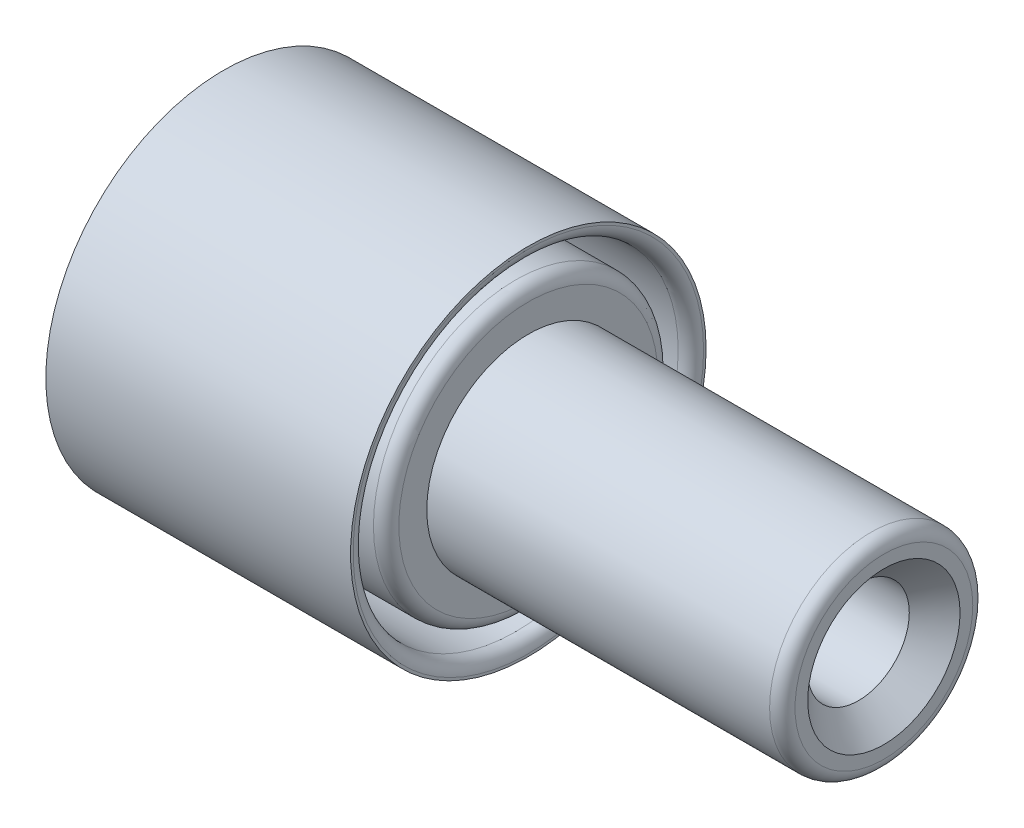
ISO-10303-21;
HEADER;
FILE_DESCRIPTION(('STEP AP214'),'2;1');
FILE_NAME('part.step','',(''),(''),'','','');
FILE_SCHEMA(('AUTOMOTIVE_DESIGN { 1 0 10303 214 1 1 1 1 }'));
ENDSEC;
DATA;
#1=APPLICATION_CONTEXT('core data for automotive mechanical design processes');
#2=APPLICATION_PROTOCOL_DEFINITION('international standard','automotive_design',2000,#1);
#3=PRODUCT_CONTEXT('',#1,'mechanical');
#4=PRODUCT('Part','Part','',(#3));
#5=PRODUCT_RELATED_PRODUCT_CATEGORY('part','',(#4));
#6=PRODUCT_DEFINITION_FORMATION('','',#4);
#7=PRODUCT_DEFINITION_CONTEXT('part definition',#1,'design');
#8=PRODUCT_DEFINITION('design','',#6,#7);
#9=PRODUCT_DEFINITION_SHAPE('','',#8);
#10=(LENGTH_UNIT() NAMED_UNIT(*) SI_UNIT(.MILLI.,.METRE.));
#11=(NAMED_UNIT(*) PLANE_ANGLE_UNIT() SI_UNIT($,.RADIAN.));
#12=(NAMED_UNIT(*) SI_UNIT($,.STERADIAN.) SOLID_ANGLE_UNIT());
#13=UNCERTAINTY_MEASURE_WITH_UNIT(LENGTH_MEASURE(1.E-05),#10,'distance_accuracy_value','');
#14=(GEOMETRIC_REPRESENTATION_CONTEXT(3) GLOBAL_UNCERTAINTY_ASSIGNED_CONTEXT((#13)) GLOBAL_UNIT_ASSIGNED_CONTEXT((#10,
#11,#12)) REPRESENTATION_CONTEXT('',''));
#15=CARTESIAN_POINT('',(0.,0.,0.));
#16=DIRECTION('',(0.,0.,1.));
#17=DIRECTION('',(1.,0.,0.));
#18=AXIS2_PLACEMENT_3D('',#15,#16,#17);
#19=CARTESIAN_POINT('',(12.,0.,0.));
#20=DIRECTION('',(-1.,0.,0.));
#21=DIRECTION('',(0.,0.,1.));
#22=AXIS2_PLACEMENT_3D('',#19,#20,#21);
#23=CYLINDRICAL_SURFACE('',#22,7.);
#24=CARTESIAN_POINT('',(12.,0.,0.));
#25=DIRECTION('',(1.,0.,0.));
#26=DIRECTION('',(0.,0.,-1.));
#27=AXIS2_PLACEMENT_3D('',#24,#25,#26);
#28=CIRCLE('',#27,7.);
#29=CARTESIAN_POINT('',(12.,0.,-7.));
#30=VERTEX_POINT('',#29);
#31=EDGE_CURVE('E88',#30,#30,#28,.T.);
#32=ORIENTED_EDGE('',*,*,#31,.F.);
#33=EDGE_LOOP('',(#32));
#34=FACE_BOUND('',#33,.T.);
#35=CARTESIAN_POINT('',(0.,0.,0.));
#36=DIRECTION('',(1.,0.,0.));
#37=DIRECTION('',(0.,0.,-1.));
#38=AXIS2_PLACEMENT_3D('',#35,#36,#37);
#39=CIRCLE('',#38,7.);
#40=CARTESIAN_POINT('',(0.,0.,-7.));
#41=VERTEX_POINT('',#40);
#42=EDGE_CURVE('E85',#41,#41,#39,.T.);
#43=ORIENTED_EDGE('',*,*,#42,.T.);
#44=EDGE_LOOP('',(#43));
#45=FACE_BOUND('',#44,.T.);
#46=ADVANCED_FACE('F46',(#34,#45),#23,.T.);
#47=CARTESIAN_POINT('',(12.,0.,0.));
#48=DIRECTION('',(1.,0.,0.));
#49=DIRECTION('',(0.,0.,-1.));
#50=AXIS2_PLACEMENT_3D('',#47,#48,#49);
#51=PLANE('',#50);
#52=CARTESIAN_POINT('',(12.,0.,0.));
#53=DIRECTION('',(1.,0.,0.));
#54=DIRECTION('',(0.,0.,-1.));
#55=AXIS2_PLACEMENT_3D('',#52,#53,#54);
#56=CIRCLE('',#55,6.9);
#57=CARTESIAN_POINT('',(12.,0.,-6.9));
#58=VERTEX_POINT('',#57);
#59=EDGE_CURVE('E66',#58,#58,#56,.F.);
#60=ORIENTED_EDGE('',*,*,#59,.T.);
#61=EDGE_LOOP('',(#60));
#62=FACE_BOUND('',#61,.T.);
#63=ORIENTED_EDGE('',*,*,#31,.T.);
#64=EDGE_LOOP('',(#63));
#65=FACE_BOUND('',#64,.T.);
#66=ADVANCED_FACE('F107',(#62,#65),#51,.T.);
#67=CARTESIAN_POINT('',(0.,0.,0.));
#68=DIRECTION('',(1.,0.,0.));
#69=DIRECTION('',(0.,0.,-1.));
#70=AXIS2_PLACEMENT_3D('',#67,#68,#69);
#71=PLANE('',#70);
#72=CARTESIAN_POINT('',(0.,0.,0.));
#73=DIRECTION('',(1.,0.,0.));
#74=DIRECTION('',(0.,0.,-1.));
#75=AXIS2_PLACEMENT_3D('',#72,#73,#74);
#76=CIRCLE('',#75,3.5);
#77=CARTESIAN_POINT('',(0.,0.,3.5));
#78=VERTEX_POINT('',#77);
#79=EDGE_CURVE('E81',#78,#78,#76,.T.);
#80=ORIENTED_EDGE('',*,*,#79,.T.);
#81=EDGE_LOOP('',(#80));
#82=FACE_BOUND('',#81,.T.);
#83=ORIENTED_EDGE('',*,*,#42,.F.);
#84=EDGE_LOOP('',(#83));
#85=FACE_BOUND('',#84,.T.);
#86=ADVANCED_FACE('F120',(#82,#85),#71,.F.);
#87=CARTESIAN_POINT('',(2.,0.,0.));
#88=DIRECTION('',(1.,0.,0.));
#89=DIRECTION('',(0.,0.,-1.));
#90=AXIS2_PLACEMENT_3D('',#87,#88,#89);
#91=CYLINDRICAL_SURFACE('',#90,5.6);
#92=CARTESIAN_POINT('',(11.5,0.,0.));
#93=DIRECTION('',(1.,0.,0.));
#94=DIRECTION('',(0.,0.,-1.));
#95=AXIS2_PLACEMENT_3D('',#92,#93,#94);
#96=CIRCLE('',#95,5.6);
#97=CARTESIAN_POINT('',(11.5,0.,-5.6));
#98=VERTEX_POINT('',#97);
#99=EDGE_CURVE('E57',#98,#98,#96,.F.);
#100=ORIENTED_EDGE('',*,*,#99,.T.);
#101=EDGE_LOOP('',(#100));
#102=FACE_BOUND('',#101,.T.);
#103=CARTESIAN_POINT('',(2.,0.,0.));
#104=DIRECTION('',(1.,0.,0.));
#105=DIRECTION('',(0.,0.,-1.));
#106=AXIS2_PLACEMENT_3D('',#103,#104,#105);
#107=CIRCLE('',#106,5.6);
#108=CARTESIAN_POINT('',(2.,0.,-5.6));
#109=VERTEX_POINT('',#108);
#110=EDGE_CURVE('E94',#109,#109,#107,.T.);
#111=ORIENTED_EDGE('',*,*,#110,.T.);
#112=EDGE_LOOP('',(#111));
#113=FACE_BOUND('',#112,.T.);
#114=ADVANCED_FACE('F153',(#102,#113),#91,.T.);
#115=CARTESIAN_POINT('',(2.,0.,0.));
#116=DIRECTION('',(1.,0.,0.));
#117=DIRECTION('',(0.,0.,-1.));
#118=AXIS2_PLACEMENT_3D('',#115,#116,#117);
#119=CYLINDRICAL_SURFACE('',#118,6.4);
#120=CARTESIAN_POINT('',(11.5,0.,0.));
#121=DIRECTION('',(1.,0.,0.));
#122=DIRECTION('',(0.,0.,-1.));
#123=AXIS2_PLACEMENT_3D('',#120,#121,#122);
#124=CIRCLE('',#123,6.4);
#125=CARTESIAN_POINT('',(11.5,0.,-6.4));
#126=VERTEX_POINT('',#125);
#127=EDGE_CURVE('E69',#126,#126,#124,.T.);
#128=ORIENTED_EDGE('',*,*,#127,.T.);
#129=EDGE_LOOP('',(#128));
#130=FACE_BOUND('',#129,.T.);
#131=CARTESIAN_POINT('',(2.,0.,0.));
#132=DIRECTION('',(1.,0.,0.));
#133=DIRECTION('',(0.,0.,-1.));
#134=AXIS2_PLACEMENT_3D('',#131,#132,#133);
#135=CIRCLE('',#134,6.4);
#136=CARTESIAN_POINT('',(2.,0.,-6.4));
#137=VERTEX_POINT('',#136);
#138=EDGE_CURVE('E89',#137,#137,#135,.T.);
#139=ORIENTED_EDGE('',*,*,#138,.F.);
#140=EDGE_LOOP('',(#139));
#141=FACE_BOUND('',#140,.T.);
#142=ADVANCED_FACE('F114',(#130,#141),#119,.F.);
#143=CARTESIAN_POINT('',(2.,0.,0.));
#144=DIRECTION('',(1.,0.,0.));
#145=DIRECTION('',(0.,0.,-1.));
#146=AXIS2_PLACEMENT_3D('',#143,#144,#145);
#147=PLANE('',#146);
#148=ORIENTED_EDGE('',*,*,#110,.F.);
#149=EDGE_LOOP('',(#148));
#150=FACE_BOUND('',#149,.T.);
#151=ORIENTED_EDGE('',*,*,#138,.T.);
#152=EDGE_LOOP('',(#151));
#153=FACE_BOUND('',#152,.T.);
#154=ADVANCED_FACE('F104',(#150,#153),#147,.T.);
#155=CARTESIAN_POINT('',(12.,0.,0.));
#156=DIRECTION('',(1.,0.,0.));
#157=DIRECTION('',(0.,0.,-1.));
#158=AXIS2_PLACEMENT_3D('',#155,#156,#157);
#159=CIRCLE('',#158,5.1);
#160=CARTESIAN_POINT('',(12.,0.,-5.1));
#161=VERTEX_POINT('',#160);
#162=EDGE_CURVE('E61',#161,#161,#159,.T.);
#163=ORIENTED_EDGE('',*,*,#162,.T.);
#164=EDGE_LOOP('',(#163));
#165=FACE_BOUND('',#164,.T.);
#166=CARTESIAN_POINT('',(12.,0.,0.));
#167=DIRECTION('',(1.,0.,0.));
#168=DIRECTION('',(0.,0.,-1.));
#169=AXIS2_PLACEMENT_3D('',#166,#167,#168);
#170=CIRCLE('',#169,4.);
#171=CARTESIAN_POINT('',(12.,0.,-4.));
#172=VERTEX_POINT('',#171);
#173=EDGE_CURVE('E84',#172,#172,#170,.T.);
#174=ORIENTED_EDGE('',*,*,#173,.F.);
#175=EDGE_LOOP('',(#174));
#176=FACE_BOUND('',#175,.T.);
#177=ADVANCED_FACE('F102',(#165,#176),#51,.T.);
#178=CARTESIAN_POINT('',(26.,0.,0.));
#179=DIRECTION('',(-1.,0.,0.));
#180=DIRECTION('',(0.,0.,1.));
#181=AXIS2_PLACEMENT_3D('',#178,#179,#180);
#182=CYLINDRICAL_SURFACE('',#181,4.);
#183=CARTESIAN_POINT('',(25.5,0.,0.));
#184=DIRECTION('',(1.,0.,0.));
#185=DIRECTION('',(0.,0.,-1.));
#186=AXIS2_PLACEMENT_3D('',#183,#184,#185);
#187=CIRCLE('',#186,4.);
#188=CARTESIAN_POINT('',(25.5,0.,-4.));
#189=VERTEX_POINT('',#188);
#190=EDGE_CURVE('E12',#189,#189,#187,.F.);
#191=ORIENTED_EDGE('',*,*,#190,.T.);
#192=EDGE_LOOP('',(#191));
#193=FACE_BOUND('',#192,.T.);
#194=ORIENTED_EDGE('',*,*,#173,.T.);
#195=EDGE_LOOP('',(#194));
#196=FACE_BOUND('',#195,.T.);
#197=ADVANCED_FACE('F100',(#193,#196),#182,.T.);
#198=CARTESIAN_POINT('',(26.,0.,0.));
#199=DIRECTION('',(1.,0.,0.));
#200=DIRECTION('',(0.,0.,-1.));
#201=AXIS2_PLACEMENT_3D('',#198,#199,#200);
#202=PLANE('',#201);
#203=CARTESIAN_POINT('',(26.,0.,0.));
#204=DIRECTION('',(1.,0.,0.));
#205=DIRECTION('',(0.,0.,-1.));
#206=AXIS2_PLACEMENT_3D('',#203,#204,#205);
#207=CIRCLE('',#206,3.5);
#208=CARTESIAN_POINT('',(26.,0.,-3.5));
#209=VERTEX_POINT('',#208);
#210=EDGE_CURVE('E53',#209,#209,#207,.T.);
#211=ORIENTED_EDGE('',*,*,#210,.T.);
#212=EDGE_LOOP('',(#211));
#213=FACE_BOUND('',#212,.T.);
#214=CARTESIAN_POINT('',(26.,0.,0.));
#215=DIRECTION('',(1.,0.,0.));
#216=DIRECTION('',(0.,0.,-1.));
#217=AXIS2_PLACEMENT_3D('',#214,#215,#216);
#218=CIRCLE('',#217,3.00000000000001);
#219=CARTESIAN_POINT('',(26.,0.,-3.00000000000001));
#220=VERTEX_POINT('',#219);
#221=EDGE_CURVE('E72',#220,#220,#218,.F.);
#222=ORIENTED_EDGE('',*,*,#221,.T.);
#223=EDGE_LOOP('',(#222));
#224=FACE_BOUND('',#223,.T.);
#225=ADVANCED_FACE('F112',(#213,#224),#202,.T.);
#226=CARTESIAN_POINT('',(0.,0.,0.));
#227=DIRECTION('',(1.,0.,0.));
#228=DIRECTION('',(0.,0.,-1.));
#229=AXIS2_PLACEMENT_3D('',#226,#227,#228);
#230=CYLINDRICAL_SURFACE('',#229,2.);
#231=CARTESIAN_POINT('',(25.,0.,0.));
#232=DIRECTION('',(1.,0.,0.));
#233=DIRECTION('',(0.,0.,-1.));
#234=AXIS2_PLACEMENT_3D('',#231,#232,#233);
#235=CIRCLE('',#234,2.);
#236=CARTESIAN_POINT('',(25.,0.,-2.));
#237=VERTEX_POINT('',#236);
#238=EDGE_CURVE('E75',#237,#237,#235,.T.);
#239=ORIENTED_EDGE('',*,*,#238,.T.);
#240=EDGE_LOOP('',(#239));
#241=FACE_BOUND('',#240,.T.);
#242=CARTESIAN_POINT('',(1.5,0.,0.));
#243=DIRECTION('',(1.,0.,0.));
#244=DIRECTION('',(0.,0.,-1.));
#245=AXIS2_PLACEMENT_3D('',#242,#243,#244);
#246=CIRCLE('',#245,2.);
#247=CARTESIAN_POINT('',(1.5,0.,2.));
#248=VERTEX_POINT('',#247);
#249=EDGE_CURVE('E78',#248,#248,#246,.F.);
#250=ORIENTED_EDGE('',*,*,#249,.T.);
#251=EDGE_LOOP('',(#250));
#252=FACE_BOUND('',#251,.T.);
#253=ADVANCED_FACE('F134',(#241,#252),#230,.F.);
#254=CARTESIAN_POINT('',(0.,0.,0.));
#255=DIRECTION('',(-1.,0.,0.));
#256=DIRECTION('',(0.,0.,1.));
#257=AXIS2_PLACEMENT_3D('',#254,#255,#256);
#258=CONICAL_SURFACE('',#257,3.5,0.785398163397447);
#259=CARTESIAN_POINT('',(1.5,0.,2.));
#260=CARTESIAN_POINT('',(1.484375,0.,2.015625));
#261=CARTESIAN_POINT('',(1.46875,0.,2.03125));
#262=CARTESIAN_POINT('',(1.4375,0.,2.0625));
#263=CARTESIAN_POINT('',(1.421875,0.,2.078125));
#264=CARTESIAN_POINT('',(1.390625,0.,2.109375));
#265=CARTESIAN_POINT('',(1.375,0.,2.125));
#266=CARTESIAN_POINT('',(1.34375,0.,2.15625));
#267=CARTESIAN_POINT('',(1.328125,0.,2.171875));
#268=CARTESIAN_POINT('',(1.296875,0.,2.203125));
#269=CARTESIAN_POINT('',(1.28125,0.,2.21875));
#270=CARTESIAN_POINT('',(1.25,0.,2.25));
#271=CARTESIAN_POINT('',(1.234375,0.,2.265625));
#272=CARTESIAN_POINT('',(1.203125,0.,2.296875));
#273=CARTESIAN_POINT('',(1.1875,0.,2.3125));
#274=CARTESIAN_POINT('',(1.15625,0.,2.34375));
#275=CARTESIAN_POINT('',(1.140625,0.,2.359375));
#276=CARTESIAN_POINT('',(1.109375,0.,2.390625));
#277=CARTESIAN_POINT('',(1.09375,0.,2.40625));
#278=CARTESIAN_POINT('',(1.0625,0.,2.4375));
#279=CARTESIAN_POINT('',(1.046875,0.,2.453125));
#280=CARTESIAN_POINT('',(1.015625,0.,2.484375));
#281=CARTESIAN_POINT('',(1.,0.,2.5));
#282=CARTESIAN_POINT('',(0.968750000000002,0.,2.53125));
#283=CARTESIAN_POINT('',(0.953125000000002,0.,2.546875));
#284=CARTESIAN_POINT('',(0.921875000000002,0.,2.578125));
#285=CARTESIAN_POINT('',(0.906250000000002,0.,2.59375));
#286=CARTESIAN_POINT('',(0.875000000000002,0.,2.625));
#287=CARTESIAN_POINT('',(0.859375000000002,0.,2.640625));
#288=CARTESIAN_POINT('',(0.828125000000002,0.,2.671875));
#289=CARTESIAN_POINT('',(0.812500000000002,0.,2.6875));
#290=CARTESIAN_POINT('',(0.781250000000002,0.,2.71875));
#291=CARTESIAN_POINT('',(0.765625000000002,0.,2.734375));
#292=CARTESIAN_POINT('',(0.734375000000002,0.,2.765625));
#293=CARTESIAN_POINT('',(0.718750000000002,0.,2.78125));
#294=CARTESIAN_POINT('',(0.687500000000001,0.,2.8125));
#295=CARTESIAN_POINT('',(0.671875000000001,0.,2.828125));
#296=CARTESIAN_POINT('',(0.640625000000001,0.,2.859375));
#297=CARTESIAN_POINT('',(0.625000000000001,0.,2.875));
#298=CARTESIAN_POINT('',(0.593750000000001,0.,2.90625));
#299=CARTESIAN_POINT('',(0.578125000000001,0.,2.921875));
#300=CARTESIAN_POINT('',(0.546875000000001,0.,2.953125));
#301=CARTESIAN_POINT('',(0.531250000000001,0.,2.96875));
#302=CARTESIAN_POINT('',(0.500000000000001,0.,3.));
#303=CARTESIAN_POINT('',(0.484375000000001,0.,3.015625));
#304=CARTESIAN_POINT('',(0.453125000000001,0.,3.046875));
#305=CARTESIAN_POINT('',(0.437500000000001,0.,3.0625));
#306=CARTESIAN_POINT('',(0.406250000000001,0.,3.09375));
#307=CARTESIAN_POINT('',(0.390625000000001,0.,3.109375));
#308=CARTESIAN_POINT('',(0.359375000000001,0.,3.140625));
#309=CARTESIAN_POINT('',(0.343750000000001,0.,3.15625));
#310=CARTESIAN_POINT('',(0.312500000000001,0.,3.1875));
#311=CARTESIAN_POINT('',(0.296875000000001,0.,3.203125));
#312=CARTESIAN_POINT('',(0.265625000000001,0.,3.234375));
#313=CARTESIAN_POINT('',(0.250000000000001,0.,3.25));
#314=CARTESIAN_POINT('',(0.218750000000001,0.,3.28125));
#315=CARTESIAN_POINT('',(0.203125,0.,3.296875));
#316=CARTESIAN_POINT('',(0.171875,0.,3.328125));
#317=CARTESIAN_POINT('',(0.15625,0.,3.34375));
#318=CARTESIAN_POINT('',(0.125,0.,3.375));
#319=CARTESIAN_POINT('',(0.109375,0.,3.390625));
#320=CARTESIAN_POINT('',(0.0781250000000002,0.,3.421875));
#321=CARTESIAN_POINT('',(0.0625000000000001,0.,3.4375));
#322=CARTESIAN_POINT('',(0.03125,0.,3.46875));
#323=CARTESIAN_POINT('',(0.015625,0.,3.484375));
#324=CARTESIAN_POINT('',(0.,0.,3.5));
#325=B_SPLINE_CURVE_WITH_KNOTS('',3,(#259,#260,#261,#262,#263,#264,#265,#266,#267,#268,#269,
#270,#271,#272,#273,#274,#275,#276,#277,#278,#279,#280,#281,#282,#283,#284,#285,#286,#287,#288,
#289,#290,#291,#292,#293,#294,#295,#296,#297,#298,#299,#300,#301,#302,#303,#304,#305,#306,#307,
#308,#309,#310,#311,#312,#313,#314,#315,#316,#317,#318,#319,#320,#321,#322,#323,#324),
.UNSPECIFIED.,.F.,.F.,(4,2,2,2,2,2,2,2,2,2,2,2,2,2,2,2,2,2,2,2,2,2,2,2,2,2,2,2,2,2,2,2,4),(0.,
0.0662912607362389,0.132582521472478,0.198873782208717,0.265165042944955,0.331456303681195,
0.397747564417433,0.464038825153672,0.530330085889911,0.59662134662615,0.662912607362389,
0.729203868098628,0.795495128834867,0.861786389571106,0.928077650307345,0.994368911043584,
1.06066017177982,1.12695143251606,1.1932426932523,1.25953395398854,1.32582521472478,
1.39211647546102,1.45840773619726,1.52469899693349,1.59099025766973,1.65728151840597,
1.72357277914221,1.78986403987845,1.85615530061469,1.92244656135093,1.98873782208717,
2.05502908282341,2.12132034355965),.UNSPECIFIED.);
#326=EDGE_CURVE('BSEAM130',#248,#78,#325,.T.);
#327=ORIENTED_EDGE('',*,*,#249,.F.);
#328=ORIENTED_EDGE('',*,*,#79,.F.);
#329=ORIENTED_EDGE('',*,*,#326,.T.);
#330=ORIENTED_EDGE('',*,*,#326,.F.);
#331=EDGE_LOOP('',(#327,#329,#328,#330));
#332=FACE_BOUND('',#331,.T.);
#333=ADVANCED_FACE('F130',(#332),#258,.F.);
#334=CARTESIAN_POINT('',(25.,0.,0.));
#335=DIRECTION('',(1.,0.,0.));
#336=DIRECTION('',(0.,0.,-1.));
#337=AXIS2_PLACEMENT_3D('',#334,#335,#336);
#338=CONICAL_SURFACE('',#337,2.,0.785398163397449);
#339=ORIENTED_EDGE('',*,*,#221,.F.);
#340=EDGE_LOOP('',(#339));
#341=FACE_BOUND('',#340,.T.);
#342=ORIENTED_EDGE('',*,*,#238,.F.);
#343=EDGE_LOOP('',(#342));
#344=FACE_BOUND('',#343,.T.);
#345=ADVANCED_FACE('F133',(#341,#344),#338,.F.);
#346=CARTESIAN_POINT('',(11.5,0.,0.));
#347=DIRECTION('',(1.,0.,0.));
#348=DIRECTION('',(0.,0.,-1.));
#349=AXIS2_PLACEMENT_3D('',#346,#347,#348);
#350=TOROIDAL_SURFACE('',#349,6.9,0.5);
#351=ORIENTED_EDGE('',*,*,#59,.F.);
#352=EDGE_LOOP('',(#351));
#353=FACE_BOUND('',#352,.T.);
#354=ORIENTED_EDGE('',*,*,#127,.F.);
#355=EDGE_LOOP('',(#354));
#356=FACE_BOUND('',#355,.T.);
#357=ADVANCED_FACE('F138',(#353,#356),#350,.T.);
#358=CARTESIAN_POINT('',(11.5,0.,0.));
#359=DIRECTION('',(1.,0.,0.));
#360=DIRECTION('',(0.,0.,-1.));
#361=AXIS2_PLACEMENT_3D('',#358,#359,#360);
#362=TOROIDAL_SURFACE('',#361,5.1,0.5);
#363=ORIENTED_EDGE('',*,*,#99,.F.);
#364=EDGE_LOOP('',(#363));
#365=FACE_BOUND('',#364,.T.);
#366=ORIENTED_EDGE('',*,*,#162,.F.);
#367=EDGE_LOOP('',(#366));
#368=FACE_BOUND('',#367,.T.);
#369=ADVANCED_FACE('F141',(#365,#368),#362,.T.);
#370=CARTESIAN_POINT('',(25.5,0.,0.));
#371=DIRECTION('',(1.,0.,0.));
#372=DIRECTION('',(0.,0.,-1.));
#373=AXIS2_PLACEMENT_3D('',#370,#371,#372);
#374=TOROIDAL_SURFACE('',#373,3.5,0.5);
#375=ORIENTED_EDGE('',*,*,#190,.F.);
#376=EDGE_LOOP('',(#375));
#377=FACE_BOUND('',#376,.T.);
#378=ORIENTED_EDGE('',*,*,#210,.F.);
#379=EDGE_LOOP('',(#378));
#380=FACE_BOUND('',#379,.T.);
#381=ADVANCED_FACE('F48',(#377,#380),#374,.T.);
#382=CLOSED_SHELL('',(#46,#66,#86,#114,#142,#154,#177,#197,#225,#253,#333,#345,#357,#369,#381));
#383=MANIFOLD_SOLID_BREP('B2',#382);
#384=ADVANCED_BREP_SHAPE_REPRESENTATION('',(#18,#383),#14);
#385=SHAPE_DEFINITION_REPRESENTATION(#9,#384);
ENDSEC;
END-ISO-10303-21;
